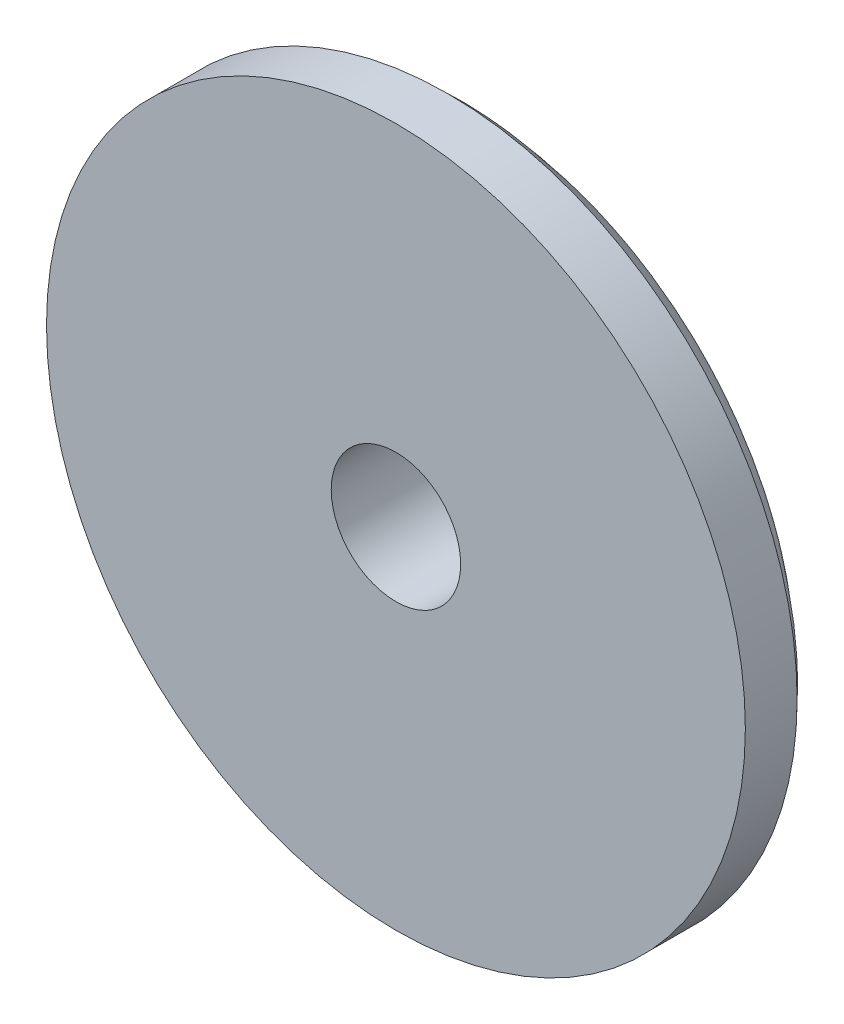
ISO-10303-21;
HEADER;
FILE_DESCRIPTION(('STEP AP214'),'2;1');
FILE_NAME('part.step','',(''),(''),'','','');
FILE_SCHEMA(('AUTOMOTIVE_DESIGN { 1 0 10303 214 1 1 1 1 }'));
ENDSEC;
DATA;
#1=APPLICATION_CONTEXT('core data for automotive mechanical design processes');
#2=APPLICATION_PROTOCOL_DEFINITION('international standard','automotive_design',2000,#1);
#3=PRODUCT_CONTEXT('',#1,'mechanical');
#4=PRODUCT('Part','Part','',(#3));
#5=PRODUCT_RELATED_PRODUCT_CATEGORY('part','',(#4));
#6=PRODUCT_DEFINITION_FORMATION('','',#4);
#7=PRODUCT_DEFINITION_CONTEXT('part definition',#1,'design');
#8=PRODUCT_DEFINITION('design','',#6,#7);
#9=PRODUCT_DEFINITION_SHAPE('','',#8);
#10=(LENGTH_UNIT() NAMED_UNIT(*) SI_UNIT(.MILLI.,.METRE.));
#11=(NAMED_UNIT(*) PLANE_ANGLE_UNIT() SI_UNIT($,.RADIAN.));
#12=(NAMED_UNIT(*) SI_UNIT($,.STERADIAN.) SOLID_ANGLE_UNIT());
#13=UNCERTAINTY_MEASURE_WITH_UNIT(LENGTH_MEASURE(1.E-05),#10,'distance_accuracy_value','');
#14=(GEOMETRIC_REPRESENTATION_CONTEXT(3) GLOBAL_UNCERTAINTY_ASSIGNED_CONTEXT((#13)) GLOBAL_UNIT_ASSIGNED_CONTEXT((#10,
#11,#12)) REPRESENTATION_CONTEXT('',''));
#15=CARTESIAN_POINT('',(0.,0.,0.));
#16=DIRECTION('',(0.,0.,1.));
#17=DIRECTION('',(1.,0.,0.));
#18=AXIS2_PLACEMENT_3D('',#15,#16,#17);
#19=CARTESIAN_POINT('',(0.,0.,0.));
#20=DIRECTION('',(0.,0.,1.));
#21=DIRECTION('',(1.,0.,0.));
#22=AXIS2_PLACEMENT_3D('',#19,#20,#21);
#23=CONICAL_SURFACE('',#22,13.5,1.10714871779409);
#24=DIRECTION('',(0.894427190999916,0.,-0.447213595499958));
#25=VECTOR('',#24,1.);
#26=CARTESIAN_POINT('',(-13.5,0.,0.));
#27=LINE('',#26,#25);
#28=CARTESIAN_POINT('',(-13.5,0.,0.));
#29=VERTEX_POINT('',#28);
#30=CARTESIAN_POINT('',(-8.5,0.,-2.5));
#31=VERTEX_POINT('',#30);
#32=EDGE_CURVE('E52',#29,#31,#27,.T.);
#33=ORIENTED_EDGE('',*,*,#32,.F.);
#34=CARTESIAN_POINT('',(0.,0.,0.));
#35=DIRECTION('',(0.,0.,-1.));
#36=DIRECTION('',(-1.,0.,0.));
#37=AXIS2_PLACEMENT_3D('',#34,#35,#36);
#38=CIRCLE('',#37,13.5);
#39=EDGE_CURVE('E12',#29,#29,#38,.T.);
#40=ORIENTED_EDGE('',*,*,#39,.F.);
#41=ORIENTED_EDGE('',*,*,#32,.T.);
#42=CARTESIAN_POINT('',(0.,0.,-2.5));
#43=DIRECTION('',(0.,0.,-1.));
#44=DIRECTION('',(-1.,0.,0.));
#45=AXIS2_PLACEMENT_3D('',#42,#43,#44);
#46=CIRCLE('',#45,8.5);
#47=EDGE_CURVE('E57',#31,#31,#46,.T.);
#48=ORIENTED_EDGE('',*,*,#47,.T.);
#49=EDGE_LOOP('',(#33,#40,#41,#48));
#50=FACE_BOUND('',#49,.T.);
#51=ADVANCED_FACE('F49',(#50),#23,.F.);
#52=CARTESIAN_POINT('',(0.,0.,4.93413087686435));
#53=DIRECTION('',(0.,0.,-1.));
#54=DIRECTION('',(-1.,0.,0.));
#55=AXIS2_PLACEMENT_3D('',#52,#53,#54);
#56=TOROIDAL_SURFACE('',#55,7.90793456156782,7.45767010384167);
#57=CARTESIAN_POINT('',(-7.90793456156782,0.,4.93413087686435));
#58=DIRECTION('',(0.,1.,0.));
#59=DIRECTION('',(0.,0.,-1.));
#60=AXIS2_PLACEMENT_3D('',#57,#58,#59);
#61=CIRCLE('',#60,7.45767010384167);
#62=EDGE_CURVE('E69',#31,#29,#61,.T.);
#63=ORIENTED_EDGE('',*,*,#62,.F.);
#64=ORIENTED_EDGE('',*,*,#47,.F.);
#65=ORIENTED_EDGE('',*,*,#62,.T.);
#66=ORIENTED_EDGE('',*,*,#39,.T.);
#67=EDGE_LOOP('',(#63,#64,#65,#66));
#68=FACE_BOUND('',#67,.T.);
#69=ADVANCED_FACE('F71',(#68),#56,.T.);
#70=CLOSED_SHELL('',(#51,#69));
#71=MANIFOLD_SOLID_BREP('B2',#70);
#72=CARTESIAN_POINT('',(0.,0.,2.));
#73=DIRECTION('',(0.,0.,-1.));
#74=DIRECTION('',(-1.,0.,0.));
#75=AXIS2_PLACEMENT_3D('',#72,#73,#74);
#76=CYLINDRICAL_SURFACE('',#75,13.5);
#77=CARTESIAN_POINT('',(0.,0.,2.));
#78=DIRECTION('',(0.,0.,1.));
#79=DIRECTION('',(1.,0.,0.));
#80=AXIS2_PLACEMENT_3D('',#77,#78,#79);
#81=CIRCLE('',#80,13.5);
#82=CARTESIAN_POINT('',(13.5,0.,2.));
#83=VERTEX_POINT('',#82);
#84=EDGE_CURVE('E96',#83,#83,#81,.T.);
#85=ORIENTED_EDGE('',*,*,#84,.F.);
#86=EDGE_LOOP('',(#85));
#87=FACE_BOUND('',#86,.T.);
#88=CARTESIAN_POINT('',(0.,0.,0.));
#89=DIRECTION('',(0.,0.,1.));
#90=DIRECTION('',(1.,0.,0.));
#91=AXIS2_PLACEMENT_3D('',#88,#89,#90);
#92=CIRCLE('',#91,13.5);
#93=CARTESIAN_POINT('',(13.5,0.,0.));
#94=VERTEX_POINT('',#93);
#95=EDGE_CURVE('E101',#94,#94,#92,.T.);
#96=ORIENTED_EDGE('',*,*,#95,.T.);
#97=EDGE_LOOP('',(#96));
#98=FACE_BOUND('',#97,.T.);
#99=ADVANCED_FACE('F89',(#87,#98),#76,.T.);
#100=CARTESIAN_POINT('',(0.,0.,2.));
#101=DIRECTION('',(0.,0.,1.));
#102=DIRECTION('',(1.,0.,0.));
#103=AXIS2_PLACEMENT_3D('',#100,#101,#102);
#104=PLANE('',#103);
#105=CARTESIAN_POINT('',(0.,0.,2.));
#106=DIRECTION('',(0.,0.,1.));
#107=DIRECTION('',(1.,0.,0.));
#108=AXIS2_PLACEMENT_3D('',#105,#106,#107);
#109=CIRCLE('',#108,2.5);
#110=CARTESIAN_POINT('',(2.5,0.,2.));
#111=VERTEX_POINT('',#110);
#112=EDGE_CURVE('E104',#111,#111,#109,.F.);
#113=ORIENTED_EDGE('',*,*,#112,.T.);
#114=EDGE_LOOP('',(#113));
#115=FACE_BOUND('',#114,.T.);
#116=ORIENTED_EDGE('',*,*,#84,.T.);
#117=EDGE_LOOP('',(#116));
#118=FACE_BOUND('',#117,.T.);
#119=ADVANCED_FACE('F119',(#115,#118),#104,.T.);
#120=CARTESIAN_POINT('',(0.,0.,0.));
#121=DIRECTION('',(0.,0.,1.));
#122=DIRECTION('',(1.,0.,0.));
#123=AXIS2_PLACEMENT_3D('',#120,#121,#122);
#124=PLANE('',#123);
#125=CARTESIAN_POINT('',(0.,0.,0.));
#126=DIRECTION('',(0.,0.,-1.));
#127=DIRECTION('',(-1.,0.,0.));
#128=AXIS2_PLACEMENT_3D('',#125,#126,#127);
#129=CIRCLE('',#128,8.5);
#130=CARTESIAN_POINT('',(-8.5,0.,0.));
#131=VERTEX_POINT('',#130);
#132=EDGE_CURVE('E48',#131,#131,#129,.T.);
#133=ORIENTED_EDGE('',*,*,#132,.F.);
#134=EDGE_LOOP('',(#133));
#135=FACE_BOUND('',#134,.T.);
#136=ORIENTED_EDGE('',*,*,#95,.F.);
#137=EDGE_LOOP('',(#136));
#138=FACE_BOUND('',#137,.T.);
#139=ADVANCED_FACE('F137',(#135,#138),#124,.F.);
#140=CARTESIAN_POINT('',(0.,0.,-2.5));
#141=DIRECTION('',(0.,0.,1.));
#142=DIRECTION('',(1.,0.,0.));
#143=AXIS2_PLACEMENT_3D('',#140,#141,#142);
#144=CYLINDRICAL_SURFACE('',#143,8.5);
#145=CARTESIAN_POINT('',(0.,0.,-2.5));
#146=DIRECTION('',(0.,0.,-1.));
#147=DIRECTION('',(-1.,0.,0.));
#148=AXIS2_PLACEMENT_3D('',#145,#146,#147);
#149=CIRCLE('',#148,8.5);
#150=CARTESIAN_POINT('',(-8.5,0.,-2.5));
#151=VERTEX_POINT('',#150);
#152=EDGE_CURVE('E92',#151,#151,#149,.T.);
#153=ORIENTED_EDGE('',*,*,#152,.F.);
#154=EDGE_LOOP('',(#153));
#155=FACE_BOUND('',#154,.T.);
#156=ORIENTED_EDGE('',*,*,#132,.T.);
#157=EDGE_LOOP('',(#156));
#158=FACE_BOUND('',#157,.T.);
#159=ADVANCED_FACE('F129',(#155,#158),#144,.T.);
#160=CARTESIAN_POINT('',(0.,0.,-2.5));
#161=DIRECTION('',(0.,0.,-1.));
#162=DIRECTION('',(-1.,0.,0.));
#163=AXIS2_PLACEMENT_3D('',#160,#161,#162);
#164=PLANE('',#163);
#165=CARTESIAN_POINT('',(0.,0.,-2.5));
#166=DIRECTION('',(0.,0.,-1.));
#167=DIRECTION('',(-1.,0.,0.));
#168=AXIS2_PLACEMENT_3D('',#165,#166,#167);
#169=CIRCLE('',#168,2.5);
#170=CARTESIAN_POINT('',(-2.5,0.,-2.5));
#171=VERTEX_POINT('',#170);
#172=EDGE_CURVE('E110',#171,#171,#169,.T.);
#173=ORIENTED_EDGE('',*,*,#172,.F.);
#174=EDGE_LOOP('',(#173));
#175=FACE_BOUND('',#174,.T.);
#176=ORIENTED_EDGE('',*,*,#152,.T.);
#177=EDGE_LOOP('',(#176));
#178=FACE_BOUND('',#177,.T.);
#179=ADVANCED_FACE('F124',(#175,#178),#164,.T.);
#180=CARTESIAN_POINT('',(0.,0.,2.001));
#181=DIRECTION('',(0.,0.,-1.));
#182=DIRECTION('',(-1.,0.,0.));
#183=AXIS2_PLACEMENT_3D('',#180,#181,#182);
#184=CYLINDRICAL_SURFACE('',#183,2.5);
#185=ORIENTED_EDGE('',*,*,#112,.F.);
#186=EDGE_LOOP('',(#185));
#187=FACE_BOUND('',#186,.T.);
#188=ORIENTED_EDGE('',*,*,#172,.T.);
#189=EDGE_LOOP('',(#188));
#190=FACE_BOUND('',#189,.T.);
#191=ADVANCED_FACE('F122',(#187,#190),#184,.F.);
#192=CLOSED_SHELL('',(#99,#119,#139,#159,#179,#191));
#193=MANIFOLD_SOLID_BREP('B6',#192);
#194=ADVANCED_BREP_SHAPE_REPRESENTATION('',(#18,#71,#193),#14);
#195=SHAPE_DEFINITION_REPRESENTATION(#9,#194);
ENDSEC;
END-ISO-10303-21;
